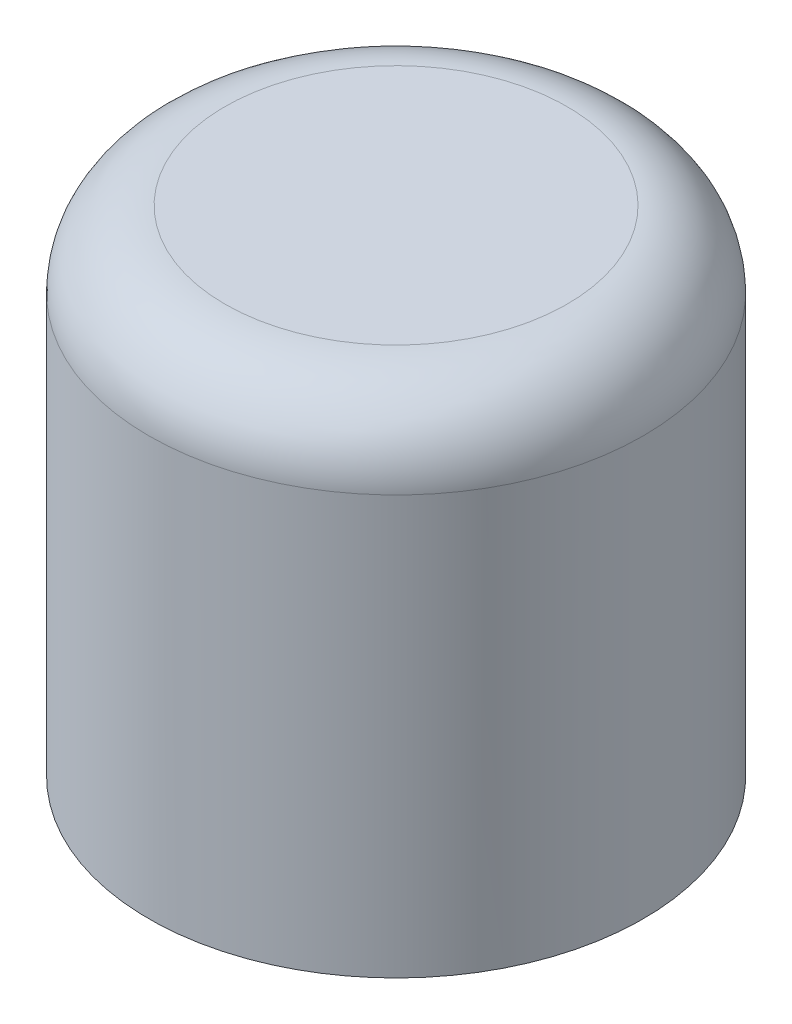
ISO-10303-21;
HEADER;
FILE_DESCRIPTION(('STEP AP214'),'2;1');
FILE_NAME('part.step','',(''),(''),'','','');
FILE_SCHEMA(('AUTOMOTIVE_DESIGN { 1 0 10303 214 1 1 1 1 }'));
ENDSEC;
DATA;
#1=APPLICATION_CONTEXT('core data for automotive mechanical design processes');
#2=APPLICATION_PROTOCOL_DEFINITION('international standard','automotive_design',2000,#1);
#3=PRODUCT_CONTEXT('',#1,'mechanical');
#4=PRODUCT('Part','Part','',(#3));
#5=PRODUCT_RELATED_PRODUCT_CATEGORY('part','',(#4));
#6=PRODUCT_DEFINITION_FORMATION('','',#4);
#7=PRODUCT_DEFINITION_CONTEXT('part definition',#1,'design');
#8=PRODUCT_DEFINITION('design','',#6,#7);
#9=PRODUCT_DEFINITION_SHAPE('','',#8);
#10=(LENGTH_UNIT() NAMED_UNIT(*) SI_UNIT(.MILLI.,.METRE.));
#11=(NAMED_UNIT(*) PLANE_ANGLE_UNIT() SI_UNIT($,.RADIAN.));
#12=(NAMED_UNIT(*) SI_UNIT($,.STERADIAN.) SOLID_ANGLE_UNIT());
#13=UNCERTAINTY_MEASURE_WITH_UNIT(LENGTH_MEASURE(1.E-05),#10,'distance_accuracy_value','');
#14=(GEOMETRIC_REPRESENTATION_CONTEXT(3) GLOBAL_UNCERTAINTY_ASSIGNED_CONTEXT((#13)) GLOBAL_UNIT_ASSIGNED_CONTEXT((#10,
#11,#12)) REPRESENTATION_CONTEXT('',''));
#15=CARTESIAN_POINT('',(0.,0.,0.));
#16=DIRECTION('',(0.,0.,1.));
#17=DIRECTION('',(1.,0.,0.));
#18=AXIS2_PLACEMENT_3D('',#15,#16,#17);
#19=CARTESIAN_POINT('',(0.,13.,0.));
#20=DIRECTION('',(0.,-1.,0.));
#21=DIRECTION('',(0.,0.,-1.));
#22=AXIS2_PLACEMENT_3D('',#19,#20,#21);
#23=CYLINDRICAL_SURFACE('',#22,6.5);
#24=CARTESIAN_POINT('',(0.,11.,0.));
#25=DIRECTION('',(0.,1.,0.));
#26=DIRECTION('',(0.,0.,1.));
#27=AXIS2_PLACEMENT_3D('',#24,#25,#26);
#28=CIRCLE('',#27,6.5);
#29=CARTESIAN_POINT('',(0.,11.,-6.5));
#30=VERTEX_POINT('',#29);
#31=EDGE_CURVE('E10',#30,#30,#28,.F.);
#32=CARTESIAN_POINT('',(0.,0.,0.));
#33=DIRECTION('',(0.,1.,0.));
#34=DIRECTION('',(0.,0.,1.));
#35=AXIS2_PLACEMENT_3D('',#32,#33,#34);
#36=CIRCLE('',#35,6.5);
#37=CARTESIAN_POINT('',(0.,0.,-6.5));
#38=VERTEX_POINT('',#37);
#39=EDGE_CURVE('E42',#38,#38,#36,.T.);
#40=CARTESIAN_POINT('',(0.,11.,-6.5));
#41=CARTESIAN_POINT('',(0.,10.8854166666667,-6.5));
#42=CARTESIAN_POINT('',(0.,10.7708333333333,-6.5));
#43=CARTESIAN_POINT('',(0.,10.5416666666667,-6.5));
#44=CARTESIAN_POINT('',(0.,10.4270833333333,-6.5));
#45=CARTESIAN_POINT('',(0.,10.1979166666667,-6.5));
#46=CARTESIAN_POINT('',(0.,10.0833333333333,-6.5));
#47=CARTESIAN_POINT('',(0.,9.85416666666667,-6.5));
#48=CARTESIAN_POINT('',(0.,9.73958333333333,-6.5));
#49=CARTESIAN_POINT('',(0.,9.51041666666667,-6.5));
#50=CARTESIAN_POINT('',(0.,9.39583333333333,-6.5));
#51=CARTESIAN_POINT('',(0.,9.16666666666666,-6.5));
#52=CARTESIAN_POINT('',(0.,9.05208333333333,-6.5));
#53=CARTESIAN_POINT('',(0.,8.82291666666666,-6.5));
#54=CARTESIAN_POINT('',(0.,8.70833333333333,-6.5));
#55=CARTESIAN_POINT('',(0.,8.47916666666666,-6.5));
#56=CARTESIAN_POINT('',(0.,8.36458333333333,-6.5));
#57=CARTESIAN_POINT('',(0.,8.13541666666667,-6.5));
#58=CARTESIAN_POINT('',(0.,8.02083333333333,-6.5));
#59=CARTESIAN_POINT('',(0.,7.79166666666667,-6.5));
#60=CARTESIAN_POINT('',(0.,7.67708333333333,-6.5));
#61=CARTESIAN_POINT('',(0.,7.44791666666667,-6.5));
#62=CARTESIAN_POINT('',(0.,7.33333333333333,-6.5));
#63=CARTESIAN_POINT('',(0.,7.10416666666667,-6.5));
#64=CARTESIAN_POINT('',(0.,6.98958333333333,-6.5));
#65=CARTESIAN_POINT('',(0.,6.76041666666667,-6.5));
#66=CARTESIAN_POINT('',(0.,6.64583333333333,-6.5));
#67=CARTESIAN_POINT('',(0.,6.41666666666667,-6.5));
#68=CARTESIAN_POINT('',(0.,6.30208333333333,-6.5));
#69=CARTESIAN_POINT('',(0.,6.07291666666667,-6.5));
#70=CARTESIAN_POINT('',(0.,5.95833333333333,-6.5));
#71=CARTESIAN_POINT('',(0.,5.72916666666667,-6.5));
#72=CARTESIAN_POINT('',(0.,5.61458333333333,-6.5));
#73=CARTESIAN_POINT('',(0.,5.38541666666667,-6.5));
#74=CARTESIAN_POINT('',(0.,5.27083333333333,-6.5));
#75=CARTESIAN_POINT('',(0.,5.04166666666667,-6.5));
#76=CARTESIAN_POINT('',(0.,4.92708333333333,-6.5));
#77=CARTESIAN_POINT('',(0.,4.69791666666667,-6.5));
#78=CARTESIAN_POINT('',(0.,4.58333333333333,-6.5));
#79=CARTESIAN_POINT('',(0.,4.35416666666667,-6.5));
#80=CARTESIAN_POINT('',(0.,4.23958333333333,-6.5));
#81=CARTESIAN_POINT('',(0.,4.01041666666667,-6.5));
#82=CARTESIAN_POINT('',(0.,3.89583333333333,-6.5));
#83=CARTESIAN_POINT('',(0.,3.66666666666667,-6.5));
#84=CARTESIAN_POINT('',(0.,3.55208333333333,-6.5));
#85=CARTESIAN_POINT('',(0.,3.32291666666667,-6.5));
#86=CARTESIAN_POINT('',(0.,3.20833333333333,-6.5));
#87=CARTESIAN_POINT('',(0.,2.97916666666667,-6.5));
#88=CARTESIAN_POINT('',(0.,2.86458333333333,-6.5));
#89=CARTESIAN_POINT('',(0.,2.63541666666667,-6.5));
#90=CARTESIAN_POINT('',(0.,2.52083333333333,-6.5));
#91=CARTESIAN_POINT('',(0.,2.29166666666667,-6.5));
#92=CARTESIAN_POINT('',(0.,2.17708333333333,-6.5));
#93=CARTESIAN_POINT('',(0.,1.94791666666667,-6.5));
#94=CARTESIAN_POINT('',(0.,1.83333333333333,-6.5));
#95=CARTESIAN_POINT('',(0.,1.60416666666667,-6.5));
#96=CARTESIAN_POINT('',(0.,1.48958333333333,-6.5));
#97=CARTESIAN_POINT('',(0.,1.26041666666667,-6.5));
#98=CARTESIAN_POINT('',(0.,1.14583333333333,-6.5));
#99=CARTESIAN_POINT('',(0.,0.916666666666666,-6.5));
#100=CARTESIAN_POINT('',(0.,0.802083333333333,-6.5));
#101=CARTESIAN_POINT('',(0.,0.572916666666667,-6.5));
#102=CARTESIAN_POINT('',(0.,0.458333333333334,-6.5));
#103=CARTESIAN_POINT('',(0.,0.229166666666667,-6.5));
#104=CARTESIAN_POINT('',(0.,0.114583333333334,-6.5));
#105=CARTESIAN_POINT('',(0.,0.,-6.5));
#106=B_SPLINE_CURVE_WITH_KNOTS('',3,(#40,#41,#42,#43,#44,#45,#46,#47,#48,#49,#50,#51,#52,#53,
#54,#55,#56,#57,#58,#59,#60,#61,#62,#63,#64,#65,#66,#67,#68,#69,#70,#71,#72,#73,#74,#75,#76,#77,
#78,#79,#80,#81,#82,#83,#84,#85,#86,#87,#88,#89,#90,#91,#92,#93,#94,#95,#96,#97,#98,#99,#100,
#101,#102,#103,#104,#105),.UNSPECIFIED.,.F.,.F.,(4,2,2,2,2,2,2,2,2,2,2,2,2,2,2,2,2,2,2,2,2,2,2,
2,2,2,2,2,2,2,2,2,4),(0.,0.343749999999999,0.687499999999999,1.03125,1.375,1.71875,2.0625,
2.40625,2.75,3.09375,3.4375,3.78125,4.125,4.46875,4.8125,5.15625,5.5,5.84375,6.1875,6.53125,
6.875,7.21875,7.5625,7.90625,8.25,8.59375,8.9375,9.28125,9.625,9.96875,10.3125,10.65625,11.),.UNSPECIFIED.);
#107=EDGE_CURVE('BSEAM31',#30,#38,#106,.T.);
#108=ORIENTED_EDGE('',*,*,#31,.T.);
#109=ORIENTED_EDGE('',*,*,#39,.T.);
#110=ORIENTED_EDGE('',*,*,#107,.T.);
#111=ORIENTED_EDGE('',*,*,#107,.F.);
#112=EDGE_LOOP('',(#108,#110,#109,#111));
#113=FACE_BOUND('',#112,.T.);
#114=ADVANCED_FACE('F31',(#113),#23,.T.);
#115=CARTESIAN_POINT('',(0.,13.,0.));
#116=DIRECTION('',(0.,1.,0.));
#117=DIRECTION('',(0.,0.,1.));
#118=AXIS2_PLACEMENT_3D('',#115,#116,#117);
#119=PLANE('',#118);
#120=CARTESIAN_POINT('',(0.,13.,0.));
#121=DIRECTION('',(0.,1.,0.));
#122=DIRECTION('',(0.,0.,1.));
#123=AXIS2_PLACEMENT_3D('',#120,#121,#122);
#124=CIRCLE('',#123,4.5);
#125=CARTESIAN_POINT('',(0.,13.,4.5));
#126=VERTEX_POINT('',#125);
#127=EDGE_CURVE('E38',#126,#126,#124,.T.);
#128=ORIENTED_EDGE('',*,*,#127,.T.);
#129=EDGE_LOOP('',(#128));
#130=FACE_BOUND('',#129,.T.);
#131=ADVANCED_FACE('F52',(#130),#119,.T.);
#132=CARTESIAN_POINT('',(0.,0.,0.));
#133=DIRECTION('',(0.,1.,0.));
#134=DIRECTION('',(0.,0.,1.));
#135=AXIS2_PLACEMENT_3D('',#132,#133,#134);
#136=PLANE('',#135);
#137=ORIENTED_EDGE('',*,*,#39,.F.);
#138=EDGE_LOOP('',(#137));
#139=FACE_BOUND('',#138,.T.);
#140=ADVANCED_FACE('F50',(#139),#136,.F.);
#141=CARTESIAN_POINT('',(0.,11.,0.));
#142=DIRECTION('',(0.,1.,0.));
#143=DIRECTION('',(0.,0.,1.));
#144=AXIS2_PLACEMENT_3D('',#141,#142,#143);
#145=TOROIDAL_SURFACE('',#144,4.5,2.);
#146=ORIENTED_EDGE('',*,*,#31,.F.);
#147=EDGE_LOOP('',(#146));
#148=FACE_BOUND('',#147,.T.);
#149=ORIENTED_EDGE('',*,*,#127,.F.);
#150=EDGE_LOOP('',(#149));
#151=FACE_BOUND('',#150,.T.);
#152=ADVANCED_FACE('F33',(#148,#151),#145,.T.);
#153=CLOSED_SHELL('',(#114,#131,#140,#152));
#154=MANIFOLD_SOLID_BREP('B2',#153);
#155=ADVANCED_BREP_SHAPE_REPRESENTATION('',(#18,#154),#14);
#156=SHAPE_DEFINITION_REPRESENTATION(#9,#155);
ENDSEC;
END-ISO-10303-21;
